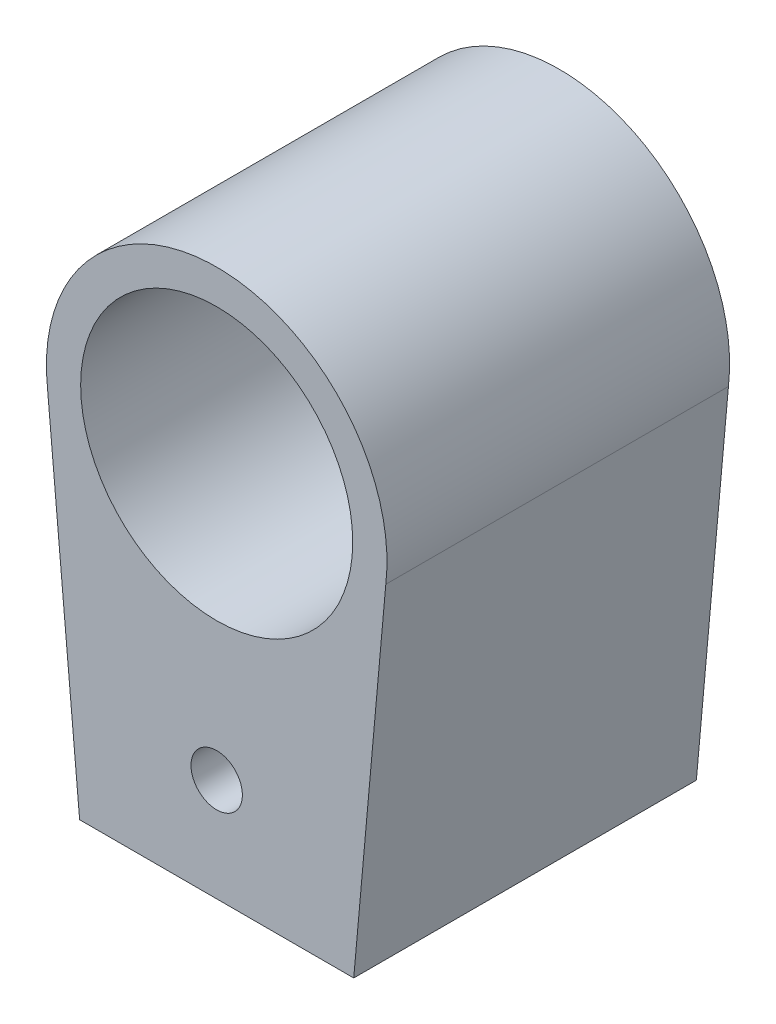
ISO-10303-21;
HEADER;
FILE_DESCRIPTION(('STEP AP214'),'2;1');
FILE_NAME('part.step','',(''),(''),'','','');
FILE_SCHEMA(('AUTOMOTIVE_DESIGN { 1 0 10303 214 1 1 1 1 }'));
ENDSEC;
DATA;
#1=APPLICATION_CONTEXT('core data for automotive mechanical design processes');
#2=APPLICATION_PROTOCOL_DEFINITION('international standard','automotive_design',2000,#1);
#3=PRODUCT_CONTEXT('',#1,'mechanical');
#4=PRODUCT('Part','Part','',(#3));
#5=PRODUCT_RELATED_PRODUCT_CATEGORY('part','',(#4));
#6=PRODUCT_DEFINITION_FORMATION('','',#4);
#7=PRODUCT_DEFINITION_CONTEXT('part definition',#1,'design');
#8=PRODUCT_DEFINITION('design','',#6,#7);
#9=PRODUCT_DEFINITION_SHAPE('','',#8);
#10=(LENGTH_UNIT() NAMED_UNIT(*) SI_UNIT(.MILLI.,.METRE.));
#11=(NAMED_UNIT(*) PLANE_ANGLE_UNIT() SI_UNIT($,.RADIAN.));
#12=(NAMED_UNIT(*) SI_UNIT($,.STERADIAN.) SOLID_ANGLE_UNIT());
#13=UNCERTAINTY_MEASURE_WITH_UNIT(LENGTH_MEASURE(1.E-05),#10,'distance_accuracy_value','');
#14=(GEOMETRIC_REPRESENTATION_CONTEXT(3) GLOBAL_UNCERTAINTY_ASSIGNED_CONTEXT((#13)) GLOBAL_UNIT_ASSIGNED_CONTEXT((#10,
#11,#12)) REPRESENTATION_CONTEXT('',''));
#15=CARTESIAN_POINT('',(0.,0.,0.));
#16=DIRECTION('',(0.,0.,1.));
#17=DIRECTION('',(1.,0.,0.));
#18=AXIS2_PLACEMENT_3D('',#15,#16,#17);
#19=CARTESIAN_POINT('',(-5.,0.,10.));
#20=DIRECTION('',(1.,0.,0.));
#21=DIRECTION('',(0.,0.,-1.));
#22=AXIS2_PLACEMENT_3D('',#19,#20,#21);
#23=PLANE('',#22);
#24=DIRECTION('',(0.,0.,-1.));
#25=VECTOR('',#24,1.);
#26=CARTESIAN_POINT('',(-5.,-12.,10.));
#27=LINE('',#26,#25);
#28=CARTESIAN_POINT('',(-5.,-12.,2.25));
#29=VERTEX_POINT('',#28);
#30=CARTESIAN_POINT('',(-5.,-12.,-2.25));
#31=VERTEX_POINT('',#30);
#32=EDGE_CURVE('E196',#29,#31,#27,.T.);
#33=ORIENTED_EDGE('',*,*,#32,.F.);
#34=DIRECTION('',(0.,-1.,0.));
#35=VECTOR('',#34,1.);
#36=CARTESIAN_POINT('',(-5.,0.,2.25));
#37=LINE('',#36,#35);
#38=CARTESIAN_POINT('',(-5.,-22.,2.25));
#39=VERTEX_POINT('',#38);
#40=EDGE_CURVE('E63',#29,#39,#37,.T.);
#41=ORIENTED_EDGE('',*,*,#40,.T.);
#42=DIRECTION('',(0.,0.,-1.));
#43=VECTOR('',#42,1.);
#44=CARTESIAN_POINT('',(-5.,-22.,10.));
#45=LINE('',#44,#43);
#46=CARTESIAN_POINT('',(-5.,-22.,-2.25));
#47=VERTEX_POINT('',#46);
#48=EDGE_CURVE('E199',#39,#47,#45,.T.);
#49=ORIENTED_EDGE('',*,*,#48,.T.);
#50=DIRECTION('',(0.,-1.,0.));
#51=VECTOR('',#50,1.);
#52=CARTESIAN_POINT('',(-5.,0.,-2.25));
#53=LINE('',#52,#51);
#54=EDGE_CURVE('E230',#31,#47,#53,.T.);
#55=ORIENTED_EDGE('',*,*,#54,.F.);
#56=EDGE_LOOP('',(#33,#41,#49,#55));
#57=FACE_BOUND('',#56,.T.);
#58=ADVANCED_FACE('F47',(#57),#23,.T.);
#59=CARTESIAN_POINT('',(0.,-12.,10.));
#60=DIRECTION('',(0.,-1.,0.));
#61=DIRECTION('',(1.,0.,0.));
#62=AXIS2_PLACEMENT_3D('',#59,#60,#61);
#63=PLANE('',#62);
#64=DIRECTION('',(0.,0.,-1.));
#65=VECTOR('',#64,1.);
#66=CARTESIAN_POINT('',(5.,-12.,10.));
#67=LINE('',#66,#65);
#68=CARTESIAN_POINT('',(5.,-12.,2.25));
#69=VERTEX_POINT('',#68);
#70=CARTESIAN_POINT('',(5.,-12.,-2.25));
#71=VERTEX_POINT('',#70);
#72=EDGE_CURVE('E193',#69,#71,#67,.T.);
#73=ORIENTED_EDGE('',*,*,#72,.F.);
#74=DIRECTION('',(-1.,0.,0.));
#75=VECTOR('',#74,1.);
#76=CARTESIAN_POINT('',(0.,-12.,2.25));
#77=LINE('',#76,#75);
#78=EDGE_CURVE('E71',#69,#29,#77,.T.);
#79=ORIENTED_EDGE('',*,*,#78,.T.);
#80=ORIENTED_EDGE('',*,*,#32,.T.);
#81=DIRECTION('',(-1.,0.,0.));
#82=VECTOR('',#81,1.);
#83=CARTESIAN_POINT('',(0.,-12.,-2.25));
#84=LINE('',#83,#82);
#85=EDGE_CURVE('E236',#71,#31,#84,.T.);
#86=ORIENTED_EDGE('',*,*,#85,.F.);
#87=EDGE_LOOP('',(#73,#79,#80,#86));
#88=FACE_BOUND('',#87,.T.);
#89=ADVANCED_FACE('F261',(#88),#63,.T.);
#90=CARTESIAN_POINT('',(5.,0.,10.));
#91=DIRECTION('',(1.,0.,0.));
#92=DIRECTION('',(0.,1.,0.));
#93=AXIS2_PLACEMENT_3D('',#90,#91,#92);
#94=PLANE('',#93);
#95=DIRECTION('',(0.,-1.,0.));
#96=VECTOR('',#95,1.);
#97=CARTESIAN_POINT('',(5.,0.,2.25));
#98=LINE('',#97,#96);
#99=CARTESIAN_POINT('',(5.,-22.,2.25));
#100=VERTEX_POINT('',#99);
#101=EDGE_CURVE('E164',#69,#100,#98,.T.);
#102=ORIENTED_EDGE('',*,*,#101,.F.);
#103=ORIENTED_EDGE('',*,*,#72,.T.);
#104=DIRECTION('',(0.,-1.,0.));
#105=VECTOR('',#104,1.);
#106=CARTESIAN_POINT('',(5.,0.,-2.25));
#107=LINE('',#106,#105);
#108=CARTESIAN_POINT('',(5.,-22.,-2.25));
#109=VERTEX_POINT('',#108);
#110=EDGE_CURVE('E227',#71,#109,#107,.T.);
#111=ORIENTED_EDGE('',*,*,#110,.T.);
#112=DIRECTION('',(0.,0.,-1.));
#113=VECTOR('',#112,1.);
#114=CARTESIAN_POINT('',(5.,-22.,10.));
#115=LINE('',#114,#113);
#116=EDGE_CURVE('E190',#100,#109,#115,.T.);
#117=ORIENTED_EDGE('',*,*,#116,.F.);
#118=EDGE_LOOP('',(#102,#103,#111,#117));
#119=FACE_BOUND('',#118,.T.);
#120=ADVANCED_FACE('F234',(#119),#94,.F.);
#121=CARTESIAN_POINT('',(9.89637583065275,-0.888978683451702,10.));
#122=DIRECTION('',(-0.995989655291459,0.0894684668047934,0.));
#123=DIRECTION('',(-0.0894684668047934,-0.995989655291459,0.));
#124=AXIS2_PLACEMENT_3D('',#121,#122,#123);
#125=PLANE('',#124);
#126=DIRECTION('',(0.,0.,-1.));
#127=VECTOR('',#126,1.);
#128=CARTESIAN_POINT('',(8.00000000000001,-22.,10.));
#129=LINE('',#128,#127);
#130=CARTESIAN_POINT('',(8.00000000000001,-22.,10.));
#131=VERTEX_POINT('',#130);
#132=CARTESIAN_POINT('',(8.00000000000001,-22.,-10.));
#133=VERTEX_POINT('',#132);
#134=EDGE_CURVE('E135',#131,#133,#129,.T.);
#135=ORIENTED_EDGE('',*,*,#134,.T.);
#136=DIRECTION('',(0.0894684668047934,0.995989655291459,0.));
#137=VECTOR('',#136,1.);
#138=CARTESIAN_POINT('',(9.89637583065275,-0.888978683451702,-10.));
#139=LINE('',#138,#137);
#140=CARTESIAN_POINT('',(9.87186370448572,-1.16185498236979,-10.));
#141=VERTEX_POINT('',#140);
#142=EDGE_CURVE('E128',#133,#141,#139,.T.);
#143=ORIENTED_EDGE('',*,*,#142,.T.);
#144=DIRECTION('',(0.,0.,-1.));
#145=VECTOR('',#144,1.);
#146=CARTESIAN_POINT('',(9.87186370448572,-1.16185498236979,10.));
#147=LINE('',#146,#145);
#148=CARTESIAN_POINT('',(9.87186370448572,-1.16185498236979,10.));
#149=VERTEX_POINT('',#148);
#150=EDGE_CURVE('E11',#149,#141,#147,.T.);
#151=ORIENTED_EDGE('',*,*,#150,.F.);
#152=DIRECTION('',(0.0894684668047934,0.995989655291459,0.));
#153=VECTOR('',#152,1.);
#154=CARTESIAN_POINT('',(9.89637583065275,-0.888978683451702,10.));
#155=LINE('',#154,#153);
#156=EDGE_CURVE('E175',#131,#149,#155,.T.);
#157=ORIENTED_EDGE('',*,*,#156,.F.);
#158=EDGE_LOOP('',(#135,#143,#151,#157));
#159=FACE_BOUND('',#158,.T.);
#160=ADVANCED_FACE('F133',(#159),#125,.F.);
#161=CARTESIAN_POINT('',(0.,0.,10.));
#162=DIRECTION('',(0.,0.,-1.));
#163=DIRECTION('',(-1.,0.,0.));
#164=AXIS2_PLACEMENT_3D('',#161,#162,#163);
#165=CYLINDRICAL_SURFACE('',#164,9.94);
#166=ORIENTED_EDGE('',*,*,#150,.T.);
#167=CARTESIAN_POINT('',(0.,0.,-10.));
#168=DIRECTION('',(0.,0.,1.));
#169=DIRECTION('',(1.,0.,0.));
#170=AXIS2_PLACEMENT_3D('',#167,#168,#169);
#171=CIRCLE('',#170,9.94);
#172=CARTESIAN_POINT('',(-9.87186370448572,-1.16185498236979,-10.));
#173=VERTEX_POINT('',#172);
#174=EDGE_CURVE('E116',#141,#173,#171,.T.);
#175=ORIENTED_EDGE('',*,*,#174,.T.);
#176=DIRECTION('',(0.,0.,-1.));
#177=VECTOR('',#176,1.);
#178=CARTESIAN_POINT('',(-9.87186370448572,-1.16185498236979,10.));
#179=LINE('',#178,#177);
#180=CARTESIAN_POINT('',(-9.87186370448572,-1.16185498236979,10.));
#181=VERTEX_POINT('',#180);
#182=EDGE_CURVE('E56',#181,#173,#179,.T.);
#183=ORIENTED_EDGE('',*,*,#182,.F.);
#184=CARTESIAN_POINT('',(0.,0.,10.));
#185=DIRECTION('',(0.,0.,1.));
#186=DIRECTION('',(1.,0.,0.));
#187=AXIS2_PLACEMENT_3D('',#184,#185,#186);
#188=CIRCLE('',#187,9.94);
#189=EDGE_CURVE('E117',#149,#181,#188,.T.);
#190=ORIENTED_EDGE('',*,*,#189,.F.);
#191=EDGE_LOOP('',(#166,#175,#183,#190));
#192=FACE_BOUND('',#191,.T.);
#193=ADVANCED_FACE('F114',(#192),#165,.T.);
#194=CARTESIAN_POINT('',(-9.89637583065276,-0.888978683451705,10.));
#195=DIRECTION('',(-0.995989655291459,-0.0894684668047937,0.));
#196=DIRECTION('',(0.0894684668047937,-0.995989655291459,0.));
#197=AXIS2_PLACEMENT_3D('',#194,#195,#196);
#198=PLANE('',#197);
#199=ORIENTED_EDGE('',*,*,#182,.T.);
#200=DIRECTION('',(-0.0894684668047937,0.995989655291459,0.));
#201=VECTOR('',#200,1.);
#202=CARTESIAN_POINT('',(-9.89637583065276,-0.888978683451705,-10.));
#203=LINE('',#202,#201);
#204=CARTESIAN_POINT('',(-8.,-22.,-10.));
#205=VERTEX_POINT('',#204);
#206=EDGE_CURVE('E130',#205,#173,#203,.T.);
#207=ORIENTED_EDGE('',*,*,#206,.F.);
#208=DIRECTION('',(0.,0.,-1.));
#209=VECTOR('',#208,1.);
#210=CARTESIAN_POINT('',(-8.,-22.,10.));
#211=LINE('',#210,#209);
#212=CARTESIAN_POINT('',(-8.,-22.,10.));
#213=VERTEX_POINT('',#212);
#214=EDGE_CURVE('E202',#213,#205,#211,.T.);
#215=ORIENTED_EDGE('',*,*,#214,.F.);
#216=DIRECTION('',(-0.0894684668047937,0.995989655291459,0.));
#217=VECTOR('',#216,1.);
#218=CARTESIAN_POINT('',(-9.89637583065276,-0.888978683451705,10.));
#219=LINE('',#218,#217);
#220=EDGE_CURVE('E180',#213,#181,#219,.T.);
#221=ORIENTED_EDGE('',*,*,#220,.T.);
#222=EDGE_LOOP('',(#199,#207,#215,#221));
#223=FACE_BOUND('',#222,.T.);
#224=ADVANCED_FACE('F206',(#223),#198,.T.);
#225=CARTESIAN_POINT('',(0.,0.,10.));
#226=DIRECTION('',(0.,0.,-1.));
#227=DIRECTION('',(-1.,0.,0.));
#228=AXIS2_PLACEMENT_3D('',#225,#226,#227);
#229=CYLINDRICAL_SURFACE('',#228,7.94);
#230=CARTESIAN_POINT('',(0.,0.,10.));
#231=DIRECTION('',(0.,0.,1.));
#232=DIRECTION('',(1.,0.,0.));
#233=AXIS2_PLACEMENT_3D('',#230,#231,#232);
#234=CIRCLE('',#233,7.94);
#235=CARTESIAN_POINT('',(7.94,0.,10.));
#236=VERTEX_POINT('',#235);
#237=EDGE_CURVE('E156',#236,#236,#234,.T.);
#238=ORIENTED_EDGE('',*,*,#237,.T.);
#239=EDGE_LOOP('',(#238));
#240=FACE_BOUND('',#239,.T.);
#241=CARTESIAN_POINT('',(0.,0.,-10.));
#242=DIRECTION('',(0.,0.,1.));
#243=DIRECTION('',(1.,0.,0.));
#244=AXIS2_PLACEMENT_3D('',#241,#242,#243);
#245=CIRCLE('',#244,7.94);
#246=CARTESIAN_POINT('',(7.94,0.,-10.));
#247=VERTEX_POINT('',#246);
#248=EDGE_CURVE('E138',#247,#247,#245,.T.);
#249=ORIENTED_EDGE('',*,*,#248,.F.);
#250=EDGE_LOOP('',(#249));
#251=FACE_BOUND('',#250,.T.);
#252=ADVANCED_FACE('F49',(#240,#251),#229,.F.);
#253=CARTESIAN_POINT('',(0.,-22.,10.));
#254=DIRECTION('',(0.,1.,0.));
#255=DIRECTION('',(-1.,0.,0.));
#256=AXIS2_PLACEMENT_3D('',#253,#254,#255);
#257=PLANE('',#256);
#258=DIRECTION('',(-1.,0.,0.));
#259=VECTOR('',#258,1.);
#260=CARTESIAN_POINT('',(0.,-22.,-10.));
#261=LINE('',#260,#259);
#262=EDGE_CURVE('E148',#133,#205,#261,.T.);
#263=ORIENTED_EDGE('',*,*,#262,.F.);
#264=ORIENTED_EDGE('',*,*,#134,.F.);
#265=DIRECTION('',(-1.,0.,0.));
#266=VECTOR('',#265,1.);
#267=CARTESIAN_POINT('',(0.,-22.,10.));
#268=LINE('',#267,#266);
#269=EDGE_CURVE('E184',#131,#213,#268,.T.);
#270=ORIENTED_EDGE('',*,*,#269,.T.);
#271=ORIENTED_EDGE('',*,*,#214,.T.);
#272=EDGE_LOOP('',(#263,#264,#270,#271));
#273=FACE_BOUND('',#272,.T.);
#274=ORIENTED_EDGE('',*,*,#116,.T.);
#275=DIRECTION('',(-1.,0.,0.));
#276=VECTOR('',#275,1.);
#277=CARTESIAN_POINT('',(0.,-22.,-2.25));
#278=LINE('',#277,#276);
#279=EDGE_CURVE('E219',#109,#47,#278,.T.);
#280=ORIENTED_EDGE('',*,*,#279,.T.);
#281=ORIENTED_EDGE('',*,*,#48,.F.);
#282=DIRECTION('',(-1.,0.,0.));
#283=VECTOR('',#282,1.);
#284=CARTESIAN_POINT('',(0.,-22.,2.25));
#285=LINE('',#284,#283);
#286=EDGE_CURVE('E160',#100,#39,#285,.T.);
#287=ORIENTED_EDGE('',*,*,#286,.F.);
#288=EDGE_LOOP('',(#274,#280,#281,#287));
#289=FACE_BOUND('',#288,.T.);
#290=ADVANCED_FACE('F212',(#273,#289),#257,.F.);
#291=CARTESIAN_POINT('',(0.,0.,10.));
#292=DIRECTION('',(0.,0.,1.));
#293=DIRECTION('',(1.,0.,0.));
#294=AXIS2_PLACEMENT_3D('',#291,#292,#293);
#295=PLANE('',#294);
#296=ORIENTED_EDGE('',*,*,#269,.F.);
#297=ORIENTED_EDGE('',*,*,#156,.T.);
#298=ORIENTED_EDGE('',*,*,#189,.T.);
#299=ORIENTED_EDGE('',*,*,#220,.F.);
#300=EDGE_LOOP('',(#296,#297,#298,#299));
#301=FACE_BOUND('',#300,.T.);
#302=ORIENTED_EDGE('',*,*,#237,.F.);
#303=EDGE_LOOP('',(#302));
#304=FACE_BOUND('',#303,.T.);
#305=CARTESIAN_POINT('',(0.,-16.,10.));
#306=DIRECTION('',(0.,0.,1.));
#307=DIRECTION('',(1.,0.,0.));
#308=AXIS2_PLACEMENT_3D('',#305,#306,#307);
#309=CIRCLE('',#308,1.5);
#310=CARTESIAN_POINT('',(1.5,-16.,10.));
#311=VERTEX_POINT('',#310);
#312=EDGE_CURVE('E152',#311,#311,#309,.T.);
#313=ORIENTED_EDGE('',*,*,#312,.F.);
#314=EDGE_LOOP('',(#313));
#315=FACE_BOUND('',#314,.T.);
#316=ADVANCED_FACE('F209',(#301,#304,#315),#295,.T.);
#317=CARTESIAN_POINT('',(0.,-16.,10.));
#318=DIRECTION('',(0.,0.,-1.));
#319=DIRECTION('',(-1.,0.,0.));
#320=AXIS2_PLACEMENT_3D('',#317,#318,#319);
#321=CYLINDRICAL_SURFACE('',#320,1.5);
#322=ORIENTED_EDGE('',*,*,#312,.T.);
#323=EDGE_LOOP('',(#322));
#324=FACE_BOUND('',#323,.T.);
#325=CARTESIAN_POINT('',(0.,-16.,2.25));
#326=DIRECTION('',(0.,0.,1.));
#327=DIRECTION('',(1.,0.,0.));
#328=AXIS2_PLACEMENT_3D('',#325,#326,#327);
#329=CIRCLE('',#328,1.5);
#330=CARTESIAN_POINT('',(1.5,-16.,2.25));
#331=VERTEX_POINT('',#330);
#332=EDGE_CURVE('E151',#331,#331,#329,.T.);
#333=ORIENTED_EDGE('',*,*,#332,.F.);
#334=EDGE_LOOP('',(#333));
#335=FACE_BOUND('',#334,.T.);
#336=ADVANCED_FACE('F282',(#324,#335),#321,.F.);
#337=CARTESIAN_POINT('',(0.,0.,2.25));
#338=DIRECTION('',(0.,0.,1.));
#339=DIRECTION('',(1.,0.,0.));
#340=AXIS2_PLACEMENT_3D('',#337,#338,#339);
#341=PLANE('',#340);
#342=ORIENTED_EDGE('',*,*,#332,.T.);
#343=EDGE_LOOP('',(#342));
#344=FACE_BOUND('',#343,.T.);
#345=ORIENTED_EDGE('',*,*,#286,.T.);
#346=ORIENTED_EDGE('',*,*,#40,.F.);
#347=ORIENTED_EDGE('',*,*,#78,.F.);
#348=ORIENTED_EDGE('',*,*,#101,.T.);
#349=EDGE_LOOP('',(#345,#346,#347,#348));
#350=FACE_BOUND('',#349,.T.);
#351=ADVANCED_FACE('F285',(#344,#350),#341,.F.);
#352=CARTESIAN_POINT('',(0.,0.,-10.));
#353=DIRECTION('',(0.,0.,-1.));
#354=DIRECTION('',(1.,0.,0.));
#355=AXIS2_PLACEMENT_3D('',#352,#353,#354);
#356=PLANE('',#355);
#357=ORIENTED_EDGE('',*,*,#262,.T.);
#358=ORIENTED_EDGE('',*,*,#206,.T.);
#359=ORIENTED_EDGE('',*,*,#174,.F.);
#360=ORIENTED_EDGE('',*,*,#142,.F.);
#361=EDGE_LOOP('',(#357,#358,#359,#360));
#362=FACE_BOUND('',#361,.T.);
#363=ORIENTED_EDGE('',*,*,#248,.T.);
#364=EDGE_LOOP('',(#363));
#365=FACE_BOUND('',#364,.T.);
#366=CARTESIAN_POINT('',(0.,-16.,-10.));
#367=DIRECTION('',(0.,0.,1.));
#368=DIRECTION('',(1.,0.,0.));
#369=AXIS2_PLACEMENT_3D('',#366,#367,#368);
#370=CIRCLE('',#369,1.5);
#371=CARTESIAN_POINT('',(1.5,-16.,-10.));
#372=VERTEX_POINT('',#371);
#373=EDGE_CURVE('E142',#372,#372,#370,.T.);
#374=ORIENTED_EDGE('',*,*,#373,.T.);
#375=EDGE_LOOP('',(#374));
#376=FACE_BOUND('',#375,.T.);
#377=ADVANCED_FACE('F126',(#362,#365,#376),#356,.T.);
#378=CARTESIAN_POINT('',(0.,-16.,-10.));
#379=DIRECTION('',(0.,0.,1.));
#380=DIRECTION('',(-1.,0.,0.));
#381=AXIS2_PLACEMENT_3D('',#378,#379,#380);
#382=CYLINDRICAL_SURFACE('',#381,1.5);
#383=ORIENTED_EDGE('',*,*,#373,.F.);
#384=EDGE_LOOP('',(#383));
#385=FACE_BOUND('',#384,.T.);
#386=CARTESIAN_POINT('',(0.,-16.,-2.25));
#387=DIRECTION('',(0.,0.,1.));
#388=DIRECTION('',(1.,0.,0.));
#389=AXIS2_PLACEMENT_3D('',#386,#387,#388);
#390=CIRCLE('',#389,1.5);
#391=CARTESIAN_POINT('',(1.5,-16.,-2.25));
#392=VERTEX_POINT('',#391);
#393=EDGE_CURVE('E232',#392,#392,#390,.T.);
#394=ORIENTED_EDGE('',*,*,#393,.T.);
#395=EDGE_LOOP('',(#394));
#396=FACE_BOUND('',#395,.T.);
#397=ADVANCED_FACE('F251',(#385,#396),#382,.F.);
#398=CARTESIAN_POINT('',(0.,0.,-2.25));
#399=DIRECTION('',(0.,0.,-1.));
#400=DIRECTION('',(1.,0.,0.));
#401=AXIS2_PLACEMENT_3D('',#398,#399,#400);
#402=PLANE('',#401);
#403=ORIENTED_EDGE('',*,*,#393,.F.);
#404=EDGE_LOOP('',(#403));
#405=FACE_BOUND('',#404,.T.);
#406=ORIENTED_EDGE('',*,*,#279,.F.);
#407=ORIENTED_EDGE('',*,*,#110,.F.);
#408=ORIENTED_EDGE('',*,*,#85,.T.);
#409=ORIENTED_EDGE('',*,*,#54,.T.);
#410=EDGE_LOOP('',(#406,#407,#408,#409));
#411=FACE_BOUND('',#410,.T.);
#412=ADVANCED_FACE('F225',(#405,#411),#402,.F.);
#413=CLOSED_SHELL('',(#58,#89,#120,#160,#193,#224,#252,#290,#316,#336,#351,#377,#397,#412));
#414=MANIFOLD_SOLID_BREP('B2',#413);
#415=ADVANCED_BREP_SHAPE_REPRESENTATION('',(#18,#414),#14);
#416=SHAPE_DEFINITION_REPRESENTATION(#9,#415);
ENDSEC;
END-ISO-10303-21;
